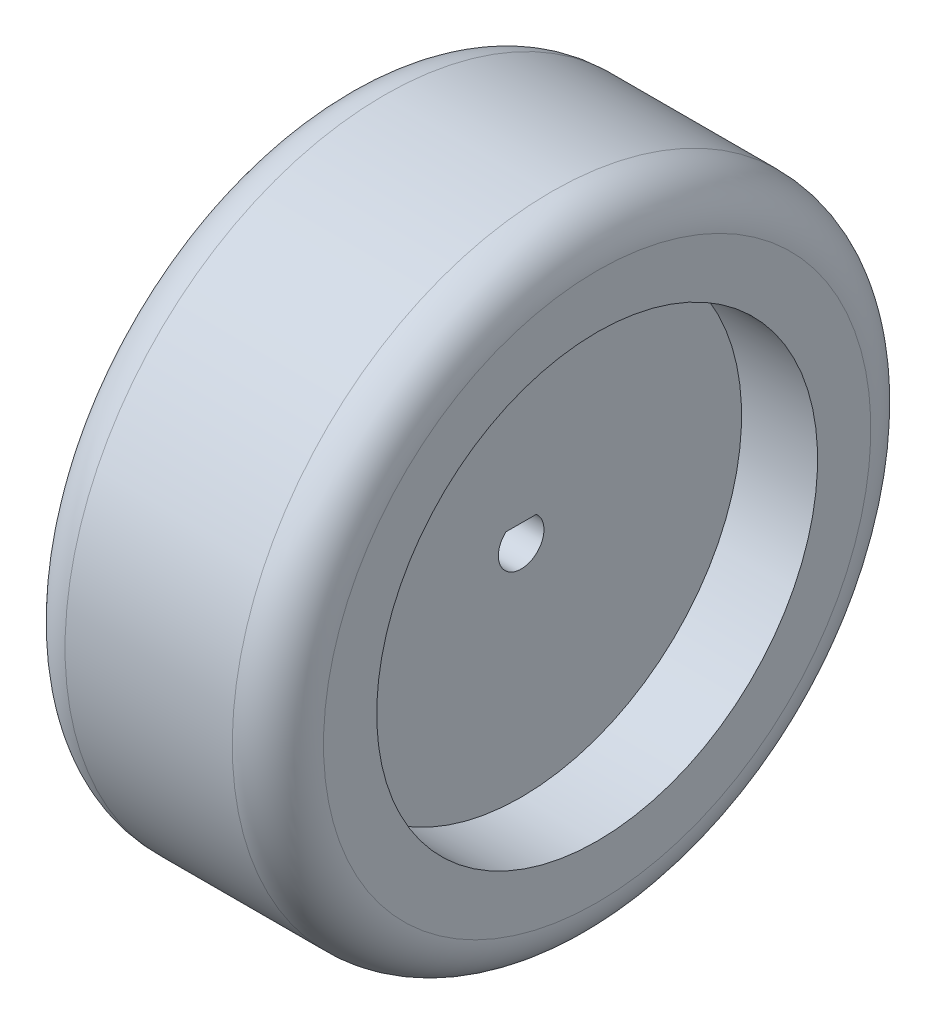
ISO-10303-21;
HEADER;
FILE_DESCRIPTION(('STEP AP214'),'2;1');
FILE_NAME('part.step','',(''),(''),'','','');
FILE_SCHEMA(('AUTOMOTIVE_DESIGN { 1 0 10303 214 1 1 1 1 }'));
ENDSEC;
DATA;
#1=APPLICATION_CONTEXT('core data for automotive mechanical design processes');
#2=APPLICATION_PROTOCOL_DEFINITION('international standard','automotive_design',2000,#1);
#3=PRODUCT_CONTEXT('',#1,'mechanical');
#4=PRODUCT('Part','Part','',(#3));
#5=PRODUCT_RELATED_PRODUCT_CATEGORY('part','',(#4));
#6=PRODUCT_DEFINITION_FORMATION('','',#4);
#7=PRODUCT_DEFINITION_CONTEXT('part definition',#1,'design');
#8=PRODUCT_DEFINITION('design','',#6,#7);
#9=PRODUCT_DEFINITION_SHAPE('','',#8);
#10=(LENGTH_UNIT() NAMED_UNIT(*) SI_UNIT(.MILLI.,.METRE.));
#11=(NAMED_UNIT(*) PLANE_ANGLE_UNIT() SI_UNIT($,.RADIAN.));
#12=(NAMED_UNIT(*) SI_UNIT($,.STERADIAN.) SOLID_ANGLE_UNIT());
#13=UNCERTAINTY_MEASURE_WITH_UNIT(LENGTH_MEASURE(1.E-05),#10,'distance_accuracy_value','');
#14=(GEOMETRIC_REPRESENTATION_CONTEXT(3) GLOBAL_UNCERTAINTY_ASSIGNED_CONTEXT((#13)) GLOBAL_UNIT_ASSIGNED_CONTEXT((#10,
#11,#12)) REPRESENTATION_CONTEXT('',''));
#15=CARTESIAN_POINT('',(0.,0.,0.));
#16=DIRECTION('',(0.,0.,1.));
#17=DIRECTION('',(1.,0.,0.));
#18=AXIS2_PLACEMENT_3D('',#15,#16,#17);
#19=CARTESIAN_POINT('',(-17.,14.5,0.));
#20=DIRECTION('',(-1.,0.,0.));
#21=DIRECTION('',(0.,-1.,0.));
#22=AXIS2_PLACEMENT_3D('',#19,#20,#21);
#23=PLANE('',#22);
#24=CARTESIAN_POINT('',(-17.,0.,0.));
#25=DIRECTION('',(-1.,0.,0.));
#26=DIRECTION('',(0.,-1.,0.));
#27=AXIS2_PLACEMENT_3D('',#24,#25,#26);
#28=CIRCLE('',#27,18.);
#29=CARTESIAN_POINT('',(-17.,-18.,0.));
#30=VERTEX_POINT('',#29);
#31=EDGE_CURVE('E48',#30,#30,#28,.T.);
#32=ORIENTED_EDGE('',*,*,#31,.T.);
#33=EDGE_LOOP('',(#32));
#34=FACE_BOUND('',#33,.T.);
#35=CARTESIAN_POINT('',(-17.,0.,0.));
#36=DIRECTION('',(1.,0.,0.));
#37=DIRECTION('',(0.,1.,0.));
#38=AXIS2_PLACEMENT_3D('',#35,#36,#37);
#39=CIRCLE('',#38,14.5);
#40=CARTESIAN_POINT('',(-17.,14.5,0.));
#41=VERTEX_POINT('',#40);
#42=EDGE_CURVE('E75',#41,#41,#39,.T.);
#43=ORIENTED_EDGE('',*,*,#42,.T.);
#44=EDGE_LOOP('',(#43));
#45=FACE_BOUND('',#44,.T.);
#46=ADVANCED_FACE('F39',(#34,#45),#23,.T.);
#47=CARTESIAN_POINT('',(-5.,0.,0.));
#48=DIRECTION('',(1.,0.,0.));
#49=DIRECTION('',(0.,1.,0.));
#50=AXIS2_PLACEMENT_3D('',#47,#48,#49);
#51=CYLINDRICAL_SURFACE('',#50,21.);
#52=CARTESIAN_POINT('',(-14.,0.,0.));
#53=DIRECTION('',(-1.,0.,0.));
#54=DIRECTION('',(0.,-1.,0.));
#55=AXIS2_PLACEMENT_3D('',#52,#53,#54);
#56=CIRCLE('',#55,21.);
#57=CARTESIAN_POINT('',(-14.,-21.,0.));
#58=VERTEX_POINT('',#57);
#59=EDGE_CURVE('E112',#58,#58,#56,.F.);
#60=ORIENTED_EDGE('',*,*,#59,.T.);
#61=EDGE_LOOP('',(#60));
#62=FACE_BOUND('',#61,.T.);
#63=CARTESIAN_POINT('',(-3.,0.,0.));
#64=DIRECTION('',(1.,0.,0.));
#65=DIRECTION('',(0.,1.,0.));
#66=AXIS2_PLACEMENT_3D('',#63,#64,#65);
#67=CIRCLE('',#66,21.);
#68=CARTESIAN_POINT('',(-3.,21.,0.));
#69=VERTEX_POINT('',#68);
#70=EDGE_CURVE('E108',#69,#69,#67,.F.);
#71=ORIENTED_EDGE('',*,*,#70,.T.);
#72=EDGE_LOOP('',(#71));
#73=FACE_BOUND('',#72,.T.);
#74=ADVANCED_FACE('F127',(#62,#73),#51,.T.);
#75=CARTESIAN_POINT('',(0.,21.,0.));
#76=DIRECTION('',(1.,0.,0.));
#77=DIRECTION('',(0.,1.,0.));
#78=AXIS2_PLACEMENT_3D('',#75,#76,#77);
#79=PLANE('',#78);
#80=CARTESIAN_POINT('',(0.,0.,0.));
#81=DIRECTION('',(1.,0.,0.));
#82=DIRECTION('',(0.,1.,0.));
#83=AXIS2_PLACEMENT_3D('',#80,#81,#82);
#84=CIRCLE('',#83,18.);
#85=CARTESIAN_POINT('',(0.,18.,0.));
#86=VERTEX_POINT('',#85);
#87=EDGE_CURVE('E11',#86,#86,#84,.T.);
#88=ORIENTED_EDGE('',*,*,#87,.T.);
#89=EDGE_LOOP('',(#88));
#90=FACE_BOUND('',#89,.T.);
#91=CARTESIAN_POINT('',(0.,0.,0.));
#92=DIRECTION('',(1.,0.,0.));
#93=DIRECTION('',(0.,1.,0.));
#94=AXIS2_PLACEMENT_3D('',#91,#92,#93);
#95=CIRCLE('',#94,14.5);
#96=CARTESIAN_POINT('',(0.,14.5,0.));
#97=VERTEX_POINT('',#96);
#98=EDGE_CURVE('E104',#97,#97,#95,.T.);
#99=ORIENTED_EDGE('',*,*,#98,.F.);
#100=EDGE_LOOP('',(#99));
#101=FACE_BOUND('',#100,.T.);
#102=ADVANCED_FACE('F130',(#90,#101),#79,.T.);
#103=CARTESIAN_POINT('',(-5.,0.,0.));
#104=DIRECTION('',(1.,0.,0.));
#105=DIRECTION('',(0.,1.,0.));
#106=AXIS2_PLACEMENT_3D('',#103,#104,#105);
#107=CYLINDRICAL_SURFACE('',#106,14.5);
#108=ORIENTED_EDGE('',*,*,#98,.T.);
#109=EDGE_LOOP('',(#108));
#110=FACE_BOUND('',#109,.T.);
#111=CARTESIAN_POINT('',(-5.,0.,0.));
#112=DIRECTION('',(1.,0.,0.));
#113=DIRECTION('',(0.,1.,0.));
#114=AXIS2_PLACEMENT_3D('',#111,#112,#113);
#115=CIRCLE('',#114,14.5);
#116=CARTESIAN_POINT('',(-5.,14.5,0.));
#117=VERTEX_POINT('',#116);
#118=EDGE_CURVE('E100',#117,#117,#115,.T.);
#119=ORIENTED_EDGE('',*,*,#118,.F.);
#120=EDGE_LOOP('',(#119));
#121=FACE_BOUND('',#120,.T.);
#122=ADVANCED_FACE('F140',(#110,#121),#107,.F.);
#123=CARTESIAN_POINT('',(-5.,14.5,0.));
#124=DIRECTION('',(1.,0.,0.));
#125=DIRECTION('',(0.,1.,0.));
#126=AXIS2_PLACEMENT_3D('',#123,#124,#125);
#127=PLANE('',#126);
#128=CARTESIAN_POINT('',(-5.,0.,0.));
#129=DIRECTION('',(1.,0.,0.));
#130=DIRECTION('',(0.,1.,0.));
#131=AXIS2_PLACEMENT_3D('',#128,#129,#130);
#132=CIRCLE('',#131,1.5);
#133=CARTESIAN_POINT('',(-5.,1.11803398874989,1.));
#134=VERTEX_POINT('',#133);
#135=CARTESIAN_POINT('',(-5.,1.11803398874989,-1.));
#136=VERTEX_POINT('',#135);
#137=EDGE_CURVE('E55',#134,#136,#132,.T.);
#138=ORIENTED_EDGE('',*,*,#137,.F.);
#139=DIRECTION('',(0.,0.,1.));
#140=VECTOR('',#139,1.);
#141=CARTESIAN_POINT('',(-5.,1.11803398874989,1.));
#142=LINE('',#141,#140);
#143=EDGE_CURVE('E80',#136,#134,#142,.T.);
#144=ORIENTED_EDGE('',*,*,#143,.F.);
#145=EDGE_LOOP('',(#138,#144));
#146=FACE_BOUND('',#145,.T.);
#147=ORIENTED_EDGE('',*,*,#118,.T.);
#148=EDGE_LOOP('',(#147));
#149=FACE_BOUND('',#148,.T.);
#150=ADVANCED_FACE('F146',(#146,#149),#127,.T.);
#151=CARTESIAN_POINT('',(-9.,0.,0.));
#152=DIRECTION('',(-1.,0.,0.));
#153=DIRECTION('',(0.,-1.,0.));
#154=AXIS2_PLACEMENT_3D('',#151,#152,#153);
#155=PLANE('',#154);
#156=CARTESIAN_POINT('',(-9.,0.,0.));
#157=DIRECTION('',(-1.,0.,0.));
#158=DIRECTION('',(0.,-1.,0.));
#159=AXIS2_PLACEMENT_3D('',#156,#157,#158);
#160=CIRCLE('',#159,1.5);
#161=CARTESIAN_POINT('',(-9.,1.11803398874989,1.));
#162=VERTEX_POINT('',#161);
#163=CARTESIAN_POINT('',(-9.,1.11803398874989,-1.));
#164=VERTEX_POINT('',#163);
#165=EDGE_CURVE('E78',#162,#164,#160,.F.);
#166=ORIENTED_EDGE('',*,*,#165,.T.);
#167=DIRECTION('',(0.,0.,1.));
#168=VECTOR('',#167,1.);
#169=CARTESIAN_POINT('',(-9.,1.11803398874989,1.));
#170=LINE('',#169,#168);
#171=EDGE_CURVE('E68',#164,#162,#170,.T.);
#172=ORIENTED_EDGE('',*,*,#171,.T.);
#173=EDGE_LOOP('',(#166,#172));
#174=FACE_BOUND('',#173,.T.);
#175=CARTESIAN_POINT('',(-9.,0.,0.));
#176=DIRECTION('',(1.,0.,0.));
#177=DIRECTION('',(0.,1.,0.));
#178=AXIS2_PLACEMENT_3D('',#175,#176,#177);
#179=CIRCLE('',#178,14.5);
#180=CARTESIAN_POINT('',(-9.,14.5,0.));
#181=VERTEX_POINT('',#180);
#182=EDGE_CURVE('E96',#181,#181,#179,.T.);
#183=ORIENTED_EDGE('',*,*,#182,.F.);
#184=EDGE_LOOP('',(#183));
#185=FACE_BOUND('',#184,.T.);
#186=ADVANCED_FACE('F82',(#174,#185),#155,.T.);
#187=CARTESIAN_POINT('',(-5.,0.,0.));
#188=DIRECTION('',(1.,0.,0.));
#189=DIRECTION('',(0.,1.,0.));
#190=AXIS2_PLACEMENT_3D('',#187,#188,#189);
#191=CYLINDRICAL_SURFACE('',#190,14.5);
#192=ORIENTED_EDGE('',*,*,#182,.T.);
#193=EDGE_LOOP('',(#192));
#194=FACE_BOUND('',#193,.T.);
#195=ORIENTED_EDGE('',*,*,#42,.F.);
#196=EDGE_LOOP('',(#195));
#197=FACE_BOUND('',#196,.T.);
#198=ADVANCED_FACE('F124',(#194,#197),#191,.F.);
#199=CARTESIAN_POINT('',(-14.,0.,0.));
#200=DIRECTION('',(-1.,0.,0.));
#201=DIRECTION('',(0.,-1.,0.));
#202=AXIS2_PLACEMENT_3D('',#199,#200,#201);
#203=TOROIDAL_SURFACE('',#202,18.,3.);
#204=ORIENTED_EDGE('',*,*,#31,.F.);
#205=EDGE_LOOP('',(#204));
#206=FACE_BOUND('',#205,.T.);
#207=ORIENTED_EDGE('',*,*,#59,.F.);
#208=EDGE_LOOP('',(#207));
#209=FACE_BOUND('',#208,.T.);
#210=ADVANCED_FACE('F121',(#206,#209),#203,.T.);
#211=CARTESIAN_POINT('',(-3.,0.,0.));
#212=DIRECTION('',(1.,0.,0.));
#213=DIRECTION('',(0.,1.,0.));
#214=AXIS2_PLACEMENT_3D('',#211,#212,#213);
#215=TOROIDAL_SURFACE('',#214,18.,3.);
#216=ORIENTED_EDGE('',*,*,#70,.F.);
#217=EDGE_LOOP('',(#216));
#218=FACE_BOUND('',#217,.T.);
#219=ORIENTED_EDGE('',*,*,#87,.F.);
#220=EDGE_LOOP('',(#219));
#221=FACE_BOUND('',#220,.T.);
#222=ADVANCED_FACE('F41',(#218,#221),#215,.T.);
#223=CARTESIAN_POINT('',(-17.001,0.,0.));
#224=DIRECTION('',(1.,0.,0.));
#225=DIRECTION('',(0.,1.,0.));
#226=AXIS2_PLACEMENT_3D('',#223,#224,#225);
#227=CYLINDRICAL_SURFACE('',#226,1.5);
#228=DIRECTION('',(1.,0.,0.));
#229=VECTOR('',#228,1.);
#230=CARTESIAN_POINT('',(-17.001,1.11803398874989,1.));
#231=LINE('',#230,#229);
#232=EDGE_CURVE('E62',#162,#134,#231,.T.);
#233=ORIENTED_EDGE('',*,*,#232,.T.);
#234=ORIENTED_EDGE('',*,*,#137,.T.);
#235=DIRECTION('',(1.,0.,0.));
#236=VECTOR('',#235,1.);
#237=CARTESIAN_POINT('',(-17.001,1.11803398874989,-1.));
#238=LINE('',#237,#236);
#239=EDGE_CURVE('E70',#164,#136,#238,.T.);
#240=ORIENTED_EDGE('',*,*,#239,.F.);
#241=ORIENTED_EDGE('',*,*,#165,.F.);
#242=EDGE_LOOP('',(#233,#234,#240,#241));
#243=FACE_BOUND('',#242,.T.);
#244=ADVANCED_FACE('F77',(#243),#227,.F.);
#245=CARTESIAN_POINT('',(-17.001,1.11803398874989,1.));
#246=DIRECTION('',(0.,1.,0.));
#247=DIRECTION('',(-1.,0.,0.));
#248=AXIS2_PLACEMENT_3D('',#245,#246,#247);
#249=PLANE('',#248);
#250=ORIENTED_EDGE('',*,*,#239,.T.);
#251=ORIENTED_EDGE('',*,*,#143,.T.);
#252=ORIENTED_EDGE('',*,*,#232,.F.);
#253=ORIENTED_EDGE('',*,*,#171,.F.);
#254=EDGE_LOOP('',(#250,#251,#252,#253));
#255=FACE_BOUND('',#254,.T.);
#256=ADVANCED_FACE('F69',(#255),#249,.F.);
#257=CLOSED_SHELL('',(#46,#74,#102,#122,#150,#186,#198,#210,#222,#244,#256));
#258=MANIFOLD_SOLID_BREP('B2',#257);
#259=ADVANCED_BREP_SHAPE_REPRESENTATION('',(#18,#258),#14);
#260=SHAPE_DEFINITION_REPRESENTATION(#9,#259);
ENDSEC;
END-ISO-10303-21;
